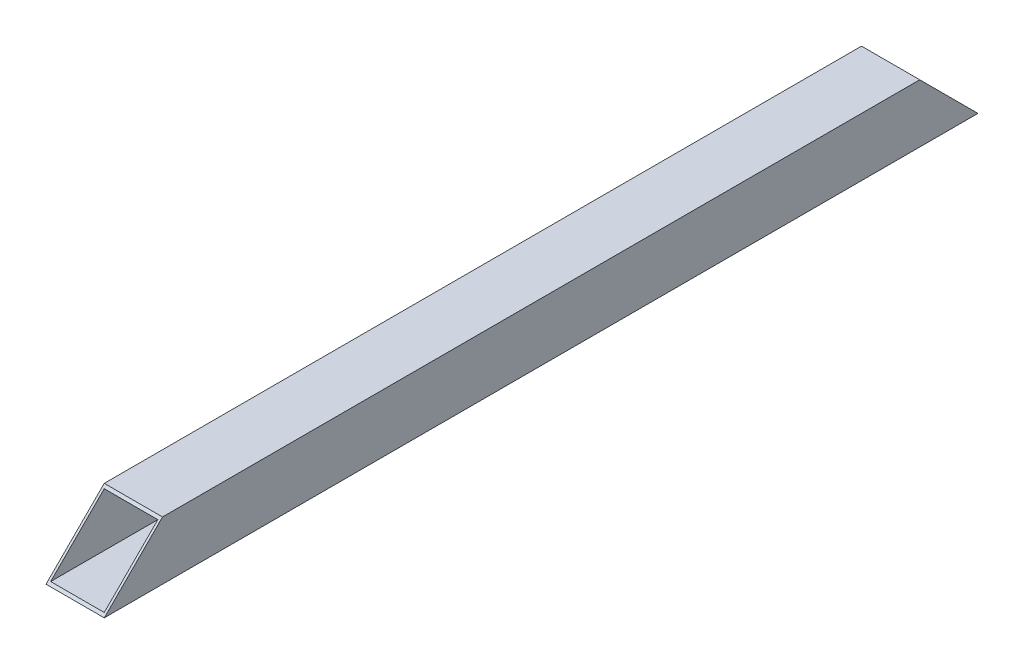
ISO-10303-21;
HEADER;
FILE_DESCRIPTION(('STEP AP214'),'2;1');
FILE_NAME('part.step','',(''),(''),'','','');
FILE_SCHEMA(('AUTOMOTIVE_DESIGN { 1 0 10303 214 1 1 1 1 }'));
ENDSEC;
DATA;
#1=APPLICATION_CONTEXT('core data for automotive mechanical design processes');
#2=APPLICATION_PROTOCOL_DEFINITION('international standard','automotive_design',2000,#1);
#3=PRODUCT_CONTEXT('',#1,'mechanical');
#4=PRODUCT('Part','Part','',(#3));
#5=PRODUCT_RELATED_PRODUCT_CATEGORY('part','',(#4));
#6=PRODUCT_DEFINITION_FORMATION('','',#4);
#7=PRODUCT_DEFINITION_CONTEXT('part definition',#1,'design');
#8=PRODUCT_DEFINITION('design','',#6,#7);
#9=PRODUCT_DEFINITION_SHAPE('','',#8);
#10=(LENGTH_UNIT() NAMED_UNIT(*) SI_UNIT(.MILLI.,.METRE.));
#11=(NAMED_UNIT(*) PLANE_ANGLE_UNIT() SI_UNIT($,.RADIAN.));
#12=(NAMED_UNIT(*) SI_UNIT($,.STERADIAN.) SOLID_ANGLE_UNIT());
#13=UNCERTAINTY_MEASURE_WITH_UNIT(LENGTH_MEASURE(1.E-05),#10,'distance_accuracy_value','');
#14=(GEOMETRIC_REPRESENTATION_CONTEXT(3) GLOBAL_UNCERTAINTY_ASSIGNED_CONTEXT((#13)) GLOBAL_UNIT_ASSIGNED_CONTEXT((#10,
#11,#12)) REPRESENTATION_CONTEXT('',''));
#15=CARTESIAN_POINT('',(0.,0.,0.));
#16=DIRECTION('',(0.,0.,1.));
#17=DIRECTION('',(1.,0.,0.));
#18=AXIS2_PLACEMENT_3D('',#15,#16,#17);
#19=CARTESIAN_POINT('',(-69.6345131491878,59.7690556492411,1500.));
#20=DIRECTION('',(1.,0.,0.));
#21=DIRECTION('',(0.,1.,0.));
#22=AXIS2_PLACEMENT_3D('',#19,#20,#21);
#23=PLANE('',#22);
#24=DIRECTION('',(0.,0.,-1.));
#25=VECTOR('',#24,1.);
#26=CARTESIAN_POINT('',(-69.6345131491878,59.7690556492411,1500.));
#27=LINE('',#26,#25);
#28=CARTESIAN_POINT('',(-69.6345131491878,59.7690556492411,1400.));
#29=VERTEX_POINT('',#28);
#30=CARTESIAN_POINT('',(-69.6345131491878,59.7690556492411,99.9999999999996));
#31=VERTEX_POINT('',#30);
#32=EDGE_CURVE('E110',#29,#31,#27,.T.);
#33=ORIENTED_EDGE('',*,*,#32,.T.);
#34=DIRECTION('',(0.,0.707106781186549,0.707106781186546));
#35=VECTOR('',#34,1.);
#36=CARTESIAN_POINT('',(-69.6345131491878,-40.2309443507589,0.));
#37=LINE('',#36,#35);
#38=CARTESIAN_POINT('',(-69.6345131491878,-40.2309443507589,0.));
#39=VERTEX_POINT('',#38);
#40=EDGE_CURVE('E46',#39,#31,#37,.T.);
#41=ORIENTED_EDGE('',*,*,#40,.F.);
#42=DIRECTION('',(0.,0.,-1.));
#43=VECTOR('',#42,1.);
#44=CARTESIAN_POINT('',(-69.6345131491878,-40.2309443507589,1500.));
#45=LINE('',#44,#43);
#46=CARTESIAN_POINT('',(-69.6345131491878,-40.2309443507589,1500.));
#47=VERTEX_POINT('',#46);
#48=EDGE_CURVE('E108',#47,#39,#45,.T.);
#49=ORIENTED_EDGE('',*,*,#48,.F.);
#50=DIRECTION('',(0.,-0.707106781186543,0.707106781186552));
#51=VECTOR('',#50,1.);
#52=CARTESIAN_POINT('',(-69.6345131491878,-40.2309443507589,1500.));
#53=LINE('',#52,#51);
#54=EDGE_CURVE('E146',#29,#47,#53,.T.);
#55=ORIENTED_EDGE('',*,*,#54,.F.);
#56=EDGE_LOOP('',(#33,#41,#49,#55));
#57=FACE_BOUND('',#56,.T.);
#58=ADVANCED_FACE('F32',(#57),#23,.F.);
#59=CARTESIAN_POINT('',(-69.6345131491878,-40.2309443507589,1500.));
#60=DIRECTION('',(0.,1.,0.));
#61=DIRECTION('',(0.,0.,1.));
#62=AXIS2_PLACEMENT_3D('',#59,#60,#61);
#63=PLANE('',#62);
#64=DIRECTION('',(1.,0.,0.));
#65=VECTOR('',#64,1.);
#66=CARTESIAN_POINT('',(-69.6345131491878,-40.2309443507589,0.));
#67=LINE('',#66,#65);
#68=CARTESIAN_POINT('',(30.3654868508122,-40.2309443507588,0.));
#69=VERTEX_POINT('',#68);
#70=EDGE_CURVE('E93',#39,#69,#67,.T.);
#71=ORIENTED_EDGE('',*,*,#70,.T.);
#72=DIRECTION('',(0.,0.,-1.));
#73=VECTOR('',#72,1.);
#74=CARTESIAN_POINT('',(30.3654868508122,-40.2309443507589,1500.));
#75=LINE('',#74,#73);
#76=CARTESIAN_POINT('',(30.3654868508122,-40.2309443507588,1500.));
#77=VERTEX_POINT('',#76);
#78=EDGE_CURVE('E115',#77,#69,#75,.T.);
#79=ORIENTED_EDGE('',*,*,#78,.F.);
#80=DIRECTION('',(1.,0.,0.));
#81=VECTOR('',#80,1.);
#82=CARTESIAN_POINT('',(-69.6345131491878,-40.2309443507589,1500.));
#83=LINE('',#82,#81);
#84=EDGE_CURVE('E101',#47,#77,#83,.T.);
#85=ORIENTED_EDGE('',*,*,#84,.F.);
#86=ORIENTED_EDGE('',*,*,#48,.T.);
#87=EDGE_LOOP('',(#71,#79,#85,#86));
#88=FACE_BOUND('',#87,.T.);
#89=ADVANCED_FACE('F114',(#88),#63,.F.);
#90=CARTESIAN_POINT('',(30.3654868508122,59.7690556492411,1500.));
#91=DIRECTION('',(-1.,0.,0.));
#92=DIRECTION('',(0.,0.,1.));
#93=AXIS2_PLACEMENT_3D('',#90,#91,#92);
#94=PLANE('',#93);
#95=ORIENTED_EDGE('',*,*,#78,.T.);
#96=DIRECTION('',(0.,0.707106781186549,0.707106781186546));
#97=VECTOR('',#96,1.);
#98=CARTESIAN_POINT('',(30.3654868508122,759.769055649241,799.999999999997));
#99=LINE('',#98,#97);
#100=CARTESIAN_POINT('',(30.3654868508122,59.7690556492412,99.9999999999996));
#101=VERTEX_POINT('',#100);
#102=EDGE_CURVE('E96',#69,#101,#99,.T.);
#103=ORIENTED_EDGE('',*,*,#102,.T.);
#104=DIRECTION('',(0.,0.,-1.));
#105=VECTOR('',#104,1.);
#106=CARTESIAN_POINT('',(30.3654868508122,59.7690556492411,1500.));
#107=LINE('',#106,#105);
#108=CARTESIAN_POINT('',(30.3654868508122,59.7690556492411,1400.));
#109=VERTEX_POINT('',#108);
#110=EDGE_CURVE('E117',#109,#101,#107,.T.);
#111=ORIENTED_EDGE('',*,*,#110,.F.);
#112=DIRECTION('',(0.,-0.707106781186543,0.707106781186552));
#113=VECTOR('',#112,1.);
#114=CARTESIAN_POINT('',(30.3654868508122,9.76905564924056,1450.));
#115=LINE('',#114,#113);
#116=EDGE_CURVE('E135',#109,#77,#115,.T.);
#117=ORIENTED_EDGE('',*,*,#116,.T.);
#118=EDGE_LOOP('',(#95,#103,#111,#117));
#119=FACE_BOUND('',#118,.T.);
#120=ADVANCED_FACE('F159',(#119),#94,.F.);
#121=CARTESIAN_POINT('',(-69.6345131491878,59.7690556492411,1500.));
#122=DIRECTION('',(0.,-1.,0.));
#123=DIRECTION('',(0.,0.,-1.));
#124=AXIS2_PLACEMENT_3D('',#121,#122,#123);
#125=PLANE('',#124);
#126=ORIENTED_EDGE('',*,*,#110,.T.);
#127=DIRECTION('',(-1.,0.,0.));
#128=VECTOR('',#127,1.);
#129=CARTESIAN_POINT('',(110.365486850812,59.7690556492412,99.9999999999996));
#130=LINE('',#129,#128);
#131=EDGE_CURVE('E111',#101,#31,#130,.T.);
#132=ORIENTED_EDGE('',*,*,#131,.T.);
#133=ORIENTED_EDGE('',*,*,#32,.F.);
#134=DIRECTION('',(-1.,0.,0.));
#135=VECTOR('',#134,1.);
#136=CARTESIAN_POINT('',(110.365486850812,59.7690556492412,1400.));
#137=LINE('',#136,#135);
#138=EDGE_CURVE('E144',#109,#29,#137,.T.);
#139=ORIENTED_EDGE('',*,*,#138,.F.);
#140=EDGE_LOOP('',(#126,#132,#133,#139));
#141=FACE_BOUND('',#140,.T.);
#142=ADVANCED_FACE('F155',(#141),#125,.F.);
#143=CARTESIAN_POINT('',(-65.6345131491878,55.7690556492411,1500.));
#144=DIRECTION('',(1.,0.,0.));
#145=DIRECTION('',(0.,1.,0.));
#146=AXIS2_PLACEMENT_3D('',#143,#144,#145);
#147=PLANE('',#146);
#148=DIRECTION('',(0.,-0.707106781186549,-0.707106781186546));
#149=VECTOR('',#148,1.);
#150=CARTESIAN_POINT('',(-65.6345131491879,757.769055649241,797.999999999997));
#151=LINE('',#150,#149);
#152=CARTESIAN_POINT('',(-65.6345131491878,55.7690556492411,95.9999999999996));
#153=VERTEX_POINT('',#152);
#154=CARTESIAN_POINT('',(-65.6345131491878,-36.2309443507589,4.));
#155=VERTEX_POINT('',#154);
#156=EDGE_CURVE('E149',#153,#155,#151,.T.);
#157=ORIENTED_EDGE('',*,*,#156,.F.);
#158=DIRECTION('',(0.,0.,-1.));
#159=VECTOR('',#158,1.);
#160=CARTESIAN_POINT('',(-65.6345131491878,55.7690556492411,1500.));
#161=LINE('',#160,#159);
#162=CARTESIAN_POINT('',(-65.6345131491878,55.7690556492411,1404.));
#163=VERTEX_POINT('',#162);
#164=EDGE_CURVE('E132',#163,#153,#161,.T.);
#165=ORIENTED_EDGE('',*,*,#164,.F.);
#166=DIRECTION('',(0.,0.707106781186543,-0.707106781186552));
#167=VECTOR('',#166,1.);
#168=CARTESIAN_POINT('',(-65.6345131491878,7.76905564924058,1452.));
#169=LINE('',#168,#167);
#170=CARTESIAN_POINT('',(-65.6345131491878,-36.2309443507589,1496.));
#171=VERTEX_POINT('',#170);
#172=EDGE_CURVE('E138',#171,#163,#169,.T.);
#173=ORIENTED_EDGE('',*,*,#172,.F.);
#174=DIRECTION('',(0.,0.,-1.));
#175=VECTOR('',#174,1.);
#176=CARTESIAN_POINT('',(-65.6345131491878,-36.2309443507589,1500.));
#177=LINE('',#176,#175);
#178=EDGE_CURVE('E102',#171,#155,#177,.T.);
#179=ORIENTED_EDGE('',*,*,#178,.T.);
#180=EDGE_LOOP('',(#157,#165,#173,#179));
#181=FACE_BOUND('',#180,.T.);
#182=ADVANCED_FACE('F185',(#181),#147,.T.);
#183=CARTESIAN_POINT('',(-65.6345131491878,-36.2309443507589,1500.));
#184=DIRECTION('',(0.,1.,0.));
#185=DIRECTION('',(0.,0.,1.));
#186=AXIS2_PLACEMENT_3D('',#183,#184,#185);
#187=PLANE('',#186);
#188=DIRECTION('',(1.,0.,0.));
#189=VECTOR('',#188,1.);
#190=CARTESIAN_POINT('',(-65.634513149188,-36.2309443507589,4.));
#191=LINE('',#190,#189);
#192=CARTESIAN_POINT('',(26.3654868508122,-36.2309443507587,4.00000000000011));
#193=VERTEX_POINT('',#192);
#194=EDGE_CURVE('E151',#155,#193,#191,.T.);
#195=ORIENTED_EDGE('',*,*,#194,.F.);
#196=ORIENTED_EDGE('',*,*,#178,.F.);
#197=DIRECTION('',(-1.,0.,0.));
#198=VECTOR('',#197,1.);
#199=CARTESIAN_POINT('',(-65.6345131491878,-36.2309443507589,1496.));
#200=LINE('',#199,#198);
#201=CARTESIAN_POINT('',(26.3654868508122,-36.2309443507589,1496.));
#202=VERTEX_POINT('',#201);
#203=EDGE_CURVE('E140',#202,#171,#200,.T.);
#204=ORIENTED_EDGE('',*,*,#203,.F.);
#205=DIRECTION('',(0.,0.,-1.));
#206=VECTOR('',#205,1.);
#207=CARTESIAN_POINT('',(26.3654868508122,-36.2309443507589,1500.));
#208=LINE('',#207,#206);
#209=EDGE_CURVE('E126',#202,#193,#208,.T.);
#210=ORIENTED_EDGE('',*,*,#209,.T.);
#211=EDGE_LOOP('',(#195,#196,#204,#210));
#212=FACE_BOUND('',#211,.T.);
#213=ADVANCED_FACE('F188',(#212),#187,.T.);
#214=CARTESIAN_POINT('',(26.3654868508122,55.7690556492411,1500.));
#215=DIRECTION('',(-1.,0.,0.));
#216=DIRECTION('',(0.,0.,1.));
#217=AXIS2_PLACEMENT_3D('',#214,#215,#216);
#218=PLANE('',#217);
#219=DIRECTION('',(0.,0.707106781186549,0.707106781186546));
#220=VECTOR('',#219,1.);
#221=CARTESIAN_POINT('',(26.3654868508122,757.769055649241,797.999999999997));
#222=LINE('',#221,#220);
#223=CARTESIAN_POINT('',(26.3654868508122,55.7690556492411,95.9999999999996));
#224=VERTEX_POINT('',#223);
#225=EDGE_CURVE('E53',#193,#224,#222,.T.);
#226=ORIENTED_EDGE('',*,*,#225,.F.);
#227=ORIENTED_EDGE('',*,*,#209,.F.);
#228=DIRECTION('',(0.,-0.707106781186543,0.707106781186552));
#229=VECTOR('',#228,1.);
#230=CARTESIAN_POINT('',(26.3654868508122,7.76905564924058,1452.));
#231=LINE('',#230,#229);
#232=CARTESIAN_POINT('',(26.3654868508122,55.7690556492411,1404.));
#233=VERTEX_POINT('',#232);
#234=EDGE_CURVE('E142',#233,#202,#231,.T.);
#235=ORIENTED_EDGE('',*,*,#234,.F.);
#236=DIRECTION('',(0.,0.,-1.));
#237=VECTOR('',#236,1.);
#238=CARTESIAN_POINT('',(26.3654868508122,55.7690556492411,1500.));
#239=LINE('',#238,#237);
#240=EDGE_CURVE('E129',#233,#224,#239,.T.);
#241=ORIENTED_EDGE('',*,*,#240,.T.);
#242=EDGE_LOOP('',(#226,#227,#235,#241));
#243=FACE_BOUND('',#242,.T.);
#244=ADVANCED_FACE('F171',(#243),#218,.T.);
#245=CARTESIAN_POINT('',(-65.6345131491878,55.7690556492411,1500.));
#246=DIRECTION('',(0.,-1.,0.));
#247=DIRECTION('',(0.,0.,-1.));
#248=AXIS2_PLACEMENT_3D('',#245,#246,#247);
#249=PLANE('',#248);
#250=DIRECTION('',(-1.,0.,0.));
#251=VECTOR('',#250,1.);
#252=CARTESIAN_POINT('',(-65.634513149188,55.7690556492411,95.9999999999996));
#253=LINE('',#252,#251);
#254=EDGE_CURVE('E11',#224,#153,#253,.T.);
#255=ORIENTED_EDGE('',*,*,#254,.F.);
#256=ORIENTED_EDGE('',*,*,#240,.F.);
#257=DIRECTION('',(1.,0.,0.));
#258=VECTOR('',#257,1.);
#259=CARTESIAN_POINT('',(-65.6345131491878,55.7690556492411,1404.));
#260=LINE('',#259,#258);
#261=EDGE_CURVE('E39',#163,#233,#260,.T.);
#262=ORIENTED_EDGE('',*,*,#261,.F.);
#263=ORIENTED_EDGE('',*,*,#164,.T.);
#264=EDGE_LOOP('',(#255,#256,#262,#263));
#265=FACE_BOUND('',#264,.T.);
#266=ADVANCED_FACE('F163',(#265),#249,.T.);
#267=CARTESIAN_POINT('',(110.365486850812,-40.2309443507588,1500.));
#268=DIRECTION('',(0.,-0.707106781186552,-0.707106781186543));
#269=DIRECTION('',(0.,0.707106781186543,-0.707106781186552));
#270=AXIS2_PLACEMENT_3D('',#267,#268,#269);
#271=PLANE('',#270);
#272=ORIENTED_EDGE('',*,*,#172,.T.);
#273=ORIENTED_EDGE('',*,*,#261,.T.);
#274=ORIENTED_EDGE('',*,*,#234,.T.);
#275=ORIENTED_EDGE('',*,*,#203,.T.);
#276=EDGE_LOOP('',(#272,#273,#274,#275));
#277=FACE_BOUND('',#276,.T.);
#278=ORIENTED_EDGE('',*,*,#138,.T.);
#279=ORIENTED_EDGE('',*,*,#54,.T.);
#280=ORIENTED_EDGE('',*,*,#84,.T.);
#281=ORIENTED_EDGE('',*,*,#116,.F.);
#282=EDGE_LOOP('',(#278,#279,#280,#281));
#283=FACE_BOUND('',#282,.T.);
#284=ADVANCED_FACE('F161',(#277,#283),#271,.F.);
#285=CARTESIAN_POINT('',(110.365486850812,-40.2309443507588,0.));
#286=DIRECTION('',(0.,-0.707106781186546,0.707106781186549));
#287=DIRECTION('',(0.,-0.707106781186549,-0.707106781186546));
#288=AXIS2_PLACEMENT_3D('',#285,#286,#287);
#289=PLANE('',#288);
#290=ORIENTED_EDGE('',*,*,#156,.T.);
#291=ORIENTED_EDGE('',*,*,#194,.T.);
#292=ORIENTED_EDGE('',*,*,#225,.T.);
#293=ORIENTED_EDGE('',*,*,#254,.T.);
#294=EDGE_LOOP('',(#290,#291,#292,#293));
#295=FACE_BOUND('',#294,.T.);
#296=ORIENTED_EDGE('',*,*,#70,.F.);
#297=ORIENTED_EDGE('',*,*,#40,.T.);
#298=ORIENTED_EDGE('',*,*,#131,.F.);
#299=ORIENTED_EDGE('',*,*,#102,.F.);
#300=EDGE_LOOP('',(#296,#297,#298,#299));
#301=FACE_BOUND('',#300,.T.);
#302=ADVANCED_FACE('F94',(#295,#301),#289,.F.);
#303=CLOSED_SHELL('',(#58,#89,#120,#142,#182,#213,#244,#266,#284,#302));
#304=MANIFOLD_SOLID_BREP('B2',#303);
#305=ADVANCED_BREP_SHAPE_REPRESENTATION('',(#18,#304),#14);
#306=SHAPE_DEFINITION_REPRESENTATION(#9,#305);
ENDSEC;
END-ISO-10303-21;
